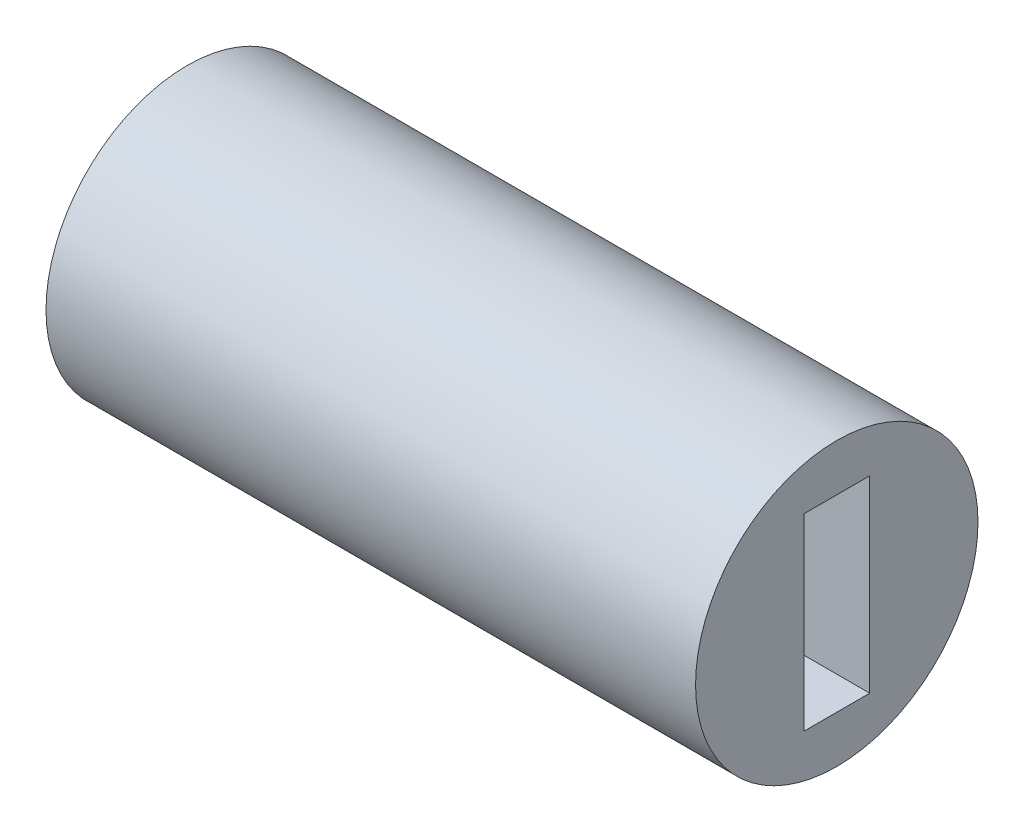
ISO-10303-21;
HEADER;
FILE_DESCRIPTION(('STEP AP214'),'2;1');
FILE_NAME('part.step','',(''),(''),'','','');
FILE_SCHEMA(('AUTOMOTIVE_DESIGN { 1 0 10303 214 1 1 1 1 }'));
ENDSEC;
DATA;
#1=APPLICATION_CONTEXT('core data for automotive mechanical design processes');
#2=APPLICATION_PROTOCOL_DEFINITION('international standard','automotive_design',2000,#1);
#3=PRODUCT_CONTEXT('',#1,'mechanical');
#4=PRODUCT('Part','Part','',(#3));
#5=PRODUCT_RELATED_PRODUCT_CATEGORY('part','',(#4));
#6=PRODUCT_DEFINITION_FORMATION('','',#4);
#7=PRODUCT_DEFINITION_CONTEXT('part definition',#1,'design');
#8=PRODUCT_DEFINITION('design','',#6,#7);
#9=PRODUCT_DEFINITION_SHAPE('','',#8);
#10=(LENGTH_UNIT() NAMED_UNIT(*) SI_UNIT(.MILLI.,.METRE.));
#11=(NAMED_UNIT(*) PLANE_ANGLE_UNIT() SI_UNIT($,.RADIAN.));
#12=(NAMED_UNIT(*) SI_UNIT($,.STERADIAN.) SOLID_ANGLE_UNIT());
#13=UNCERTAINTY_MEASURE_WITH_UNIT(LENGTH_MEASURE(1.E-05),#10,'distance_accuracy_value','');
#14=(GEOMETRIC_REPRESENTATION_CONTEXT(3) GLOBAL_UNCERTAINTY_ASSIGNED_CONTEXT((#13)) GLOBAL_UNIT_ASSIGNED_CONTEXT((#10,
#11,#12)) REPRESENTATION_CONTEXT('',''));
#15=CARTESIAN_POINT('',(0.,0.,0.));
#16=DIRECTION('',(0.,0.,1.));
#17=DIRECTION('',(1.,0.,0.));
#18=AXIS2_PLACEMENT_3D('',#15,#16,#17);
#19=CARTESIAN_POINT('',(0.,0.,0.));
#20=DIRECTION('',(1.,0.,0.));
#21=DIRECTION('',(0.,0.,-1.));
#22=AXIS2_PLACEMENT_3D('',#19,#20,#21);
#23=PLANE('',#22);
#24=DIRECTION('',(0.,0.,-1.));
#25=VECTOR('',#24,1.);
#26=CARTESIAN_POINT('',(0.,-2.,0.7));
#27=LINE('',#26,#25);
#28=CARTESIAN_POINT('',(0.,-2.,0.7));
#29=VERTEX_POINT('',#28);
#30=CARTESIAN_POINT('',(0.,-2.,-0.7));
#31=VERTEX_POINT('',#30);
#32=EDGE_CURVE('E165',#29,#31,#27,.T.);
#33=ORIENTED_EDGE('',*,*,#32,.T.);
#34=DIRECTION('',(0.,-1.,0.));
#35=VECTOR('',#34,1.);
#36=CARTESIAN_POINT('',(0.,2.5,-0.7));
#37=LINE('',#36,#35);
#38=CARTESIAN_POINT('',(0.,-2.5,-0.7));
#39=VERTEX_POINT('',#38);
#40=EDGE_CURVE('E11',#31,#39,#37,.T.);
#41=ORIENTED_EDGE('',*,*,#40,.T.);
#42=DIRECTION('',(0.,0.,1.));
#43=VECTOR('',#42,1.);
#44=CARTESIAN_POINT('',(0.,-2.5,-0.7));
#45=LINE('',#44,#43);
#46=CARTESIAN_POINT('',(0.,-2.5,0.7));
#47=VERTEX_POINT('',#46);
#48=EDGE_CURVE('E129',#39,#47,#45,.T.);
#49=ORIENTED_EDGE('',*,*,#48,.T.);
#50=DIRECTION('',(0.,1.,0.));
#51=VECTOR('',#50,1.);
#52=CARTESIAN_POINT('',(0.,2.5,0.7));
#53=LINE('',#52,#51);
#54=EDGE_CURVE('E149',#47,#29,#53,.T.);
#55=ORIENTED_EDGE('',*,*,#54,.T.);
#56=EDGE_LOOP('',(#33,#41,#49,#55));
#57=FACE_BOUND('',#56,.T.);
#58=ADVANCED_FACE('F43',(#57),#23,.F.);
#59=CARTESIAN_POINT('',(10.,0.,0.));
#60=DIRECTION('',(1.,0.,0.));
#61=DIRECTION('',(0.,0.,-1.));
#62=AXIS2_PLACEMENT_3D('',#59,#60,#61);
#63=PLANE('',#62);
#64=CARTESIAN_POINT('',(10.,0.,0.));
#65=DIRECTION('',(1.,0.,0.));
#66=DIRECTION('',(0.,0.,-1.));
#67=AXIS2_PLACEMENT_3D('',#64,#65,#66);
#68=CIRCLE('',#67,3.);
#69=CARTESIAN_POINT('',(10.,0.,-3.));
#70=VERTEX_POINT('',#69);
#71=EDGE_CURVE('E47',#70,#70,#68,.T.);
#72=ORIENTED_EDGE('',*,*,#71,.T.);
#73=EDGE_LOOP('',(#72));
#74=FACE_BOUND('',#73,.T.);
#75=DIRECTION('',(0.,0.,-1.));
#76=VECTOR('',#75,1.);
#77=CARTESIAN_POINT('',(10.,-2.,0.7));
#78=LINE('',#77,#76);
#79=CARTESIAN_POINT('',(10.,-2.,0.7));
#80=VERTEX_POINT('',#79);
#81=CARTESIAN_POINT('',(10.,-2.,-0.7));
#82=VERTEX_POINT('',#81);
#83=EDGE_CURVE('E169',#80,#82,#78,.T.);
#84=ORIENTED_EDGE('',*,*,#83,.F.);
#85=DIRECTION('',(0.,-1.,0.));
#86=VECTOR('',#85,1.);
#87=CARTESIAN_POINT('',(10.,2.,0.7));
#88=LINE('',#87,#86);
#89=CARTESIAN_POINT('',(10.,2.,0.7));
#90=VERTEX_POINT('',#89);
#91=EDGE_CURVE('E166',#90,#80,#88,.T.);
#92=ORIENTED_EDGE('',*,*,#91,.F.);
#93=DIRECTION('',(0.,0.,1.));
#94=VECTOR('',#93,1.);
#95=CARTESIAN_POINT('',(10.,2.,0.7));
#96=LINE('',#95,#94);
#97=CARTESIAN_POINT('',(10.,2.,-0.7));
#98=VERTEX_POINT('',#97);
#99=EDGE_CURVE('E176',#98,#90,#96,.T.);
#100=ORIENTED_EDGE('',*,*,#99,.F.);
#101=DIRECTION('',(0.,1.,0.));
#102=VECTOR('',#101,1.);
#103=CARTESIAN_POINT('',(10.,2.,-0.7));
#104=LINE('',#103,#102);
#105=EDGE_CURVE('E173',#82,#98,#104,.T.);
#106=ORIENTED_EDGE('',*,*,#105,.F.);
#107=EDGE_LOOP('',(#84,#92,#100,#106));
#108=FACE_BOUND('',#107,.T.);
#109=ADVANCED_FACE('F216',(#74,#108),#63,.T.);
#110=DIRECTION('',(0.,0.,-1.));
#111=VECTOR('',#110,1.);
#112=CARTESIAN_POINT('',(0.,2.5,-0.7));
#113=LINE('',#112,#111);
#114=CARTESIAN_POINT('',(0.,2.5,0.7));
#115=VERTEX_POINT('',#114);
#116=CARTESIAN_POINT('',(0.,2.5,-0.7));
#117=VERTEX_POINT('',#116);
#118=EDGE_CURVE('E123',#115,#117,#113,.T.);
#119=ORIENTED_EDGE('',*,*,#118,.T.);
#120=CARTESIAN_POINT('',(0.,2.,-0.7));
#121=VERTEX_POINT('',#120);
#122=EDGE_CURVE('E55',#117,#121,#37,.T.);
#123=ORIENTED_EDGE('',*,*,#122,.T.);
#124=DIRECTION('',(0.,0.,1.));
#125=VECTOR('',#124,1.);
#126=CARTESIAN_POINT('',(0.,2.,0.7));
#127=LINE('',#126,#125);
#128=CARTESIAN_POINT('',(0.,2.,0.7));
#129=VERTEX_POINT('',#128);
#130=EDGE_CURVE('E170',#121,#129,#127,.T.);
#131=ORIENTED_EDGE('',*,*,#130,.T.);
#132=EDGE_CURVE('E53',#129,#115,#53,.T.);
#133=ORIENTED_EDGE('',*,*,#132,.T.);
#134=EDGE_LOOP('',(#119,#123,#131,#133));
#135=FACE_BOUND('',#134,.T.);
#136=ADVANCED_FACE('F207',(#135),#23,.F.);
#137=CARTESIAN_POINT('',(10.,0.,0.));
#138=DIRECTION('',(-1.,0.,0.));
#139=DIRECTION('',(0.,0.,1.));
#140=AXIS2_PLACEMENT_3D('',#137,#138,#139);
#141=CYLINDRICAL_SURFACE('',#140,3.);
#142=ORIENTED_EDGE('',*,*,#71,.F.);
#143=EDGE_LOOP('',(#142));
#144=FACE_BOUND('',#143,.T.);
#145=CARTESIAN_POINT('',(-3.8,0.,0.));
#146=DIRECTION('',(-1.,0.,0.));
#147=DIRECTION('',(0.,0.,1.));
#148=AXIS2_PLACEMENT_3D('',#145,#146,#147);
#149=CIRCLE('',#148,3.);
#150=CARTESIAN_POINT('',(-3.8,0.,3.));
#151=VERTEX_POINT('',#150);
#152=EDGE_CURVE('E131',#151,#151,#149,.T.);
#153=ORIENTED_EDGE('',*,*,#152,.F.);
#154=EDGE_LOOP('',(#153));
#155=FACE_BOUND('',#154,.T.);
#156=ADVANCED_FACE('F45',(#144,#155),#141,.T.);
#157=CARTESIAN_POINT('',(10.,2.,0.7));
#158=DIRECTION('',(0.,0.,-1.));
#159=DIRECTION('',(-1.,0.,0.));
#160=AXIS2_PLACEMENT_3D('',#157,#158,#159);
#161=PLANE('',#160);
#162=DIRECTION('',(-1.,0.,0.));
#163=VECTOR('',#162,1.);
#164=CARTESIAN_POINT('',(10.,-2.,0.7));
#165=LINE('',#164,#163);
#166=EDGE_CURVE('E194',#80,#29,#165,.T.);
#167=ORIENTED_EDGE('',*,*,#166,.T.);
#168=ORIENTED_EDGE('',*,*,#54,.F.);
#169=DIRECTION('',(1.,0.,0.));
#170=VECTOR('',#169,1.);
#171=CARTESIAN_POINT('',(-3.8,-2.5,0.7));
#172=LINE('',#171,#170);
#173=CARTESIAN_POINT('',(-3.8,-2.5,0.7));
#174=VERTEX_POINT('',#173);
#175=EDGE_CURVE('E132',#174,#47,#172,.T.);
#176=ORIENTED_EDGE('',*,*,#175,.F.);
#177=DIRECTION('',(0.,1.,0.));
#178=VECTOR('',#177,1.);
#179=CARTESIAN_POINT('',(-3.8,2.5,0.7));
#180=LINE('',#179,#178);
#181=CARTESIAN_POINT('',(-3.8,2.5,0.7));
#182=VERTEX_POINT('',#181);
#183=EDGE_CURVE('E137',#174,#182,#180,.T.);
#184=ORIENTED_EDGE('',*,*,#183,.T.);
#185=DIRECTION('',(1.,0.,0.));
#186=VECTOR('',#185,1.);
#187=CARTESIAN_POINT('',(-3.8,2.5,0.7));
#188=LINE('',#187,#186);
#189=EDGE_CURVE('E157',#182,#115,#188,.T.);
#190=ORIENTED_EDGE('',*,*,#189,.T.);
#191=ORIENTED_EDGE('',*,*,#132,.F.);
#192=DIRECTION('',(-1.,0.,0.));
#193=VECTOR('',#192,1.);
#194=CARTESIAN_POINT('',(10.,2.,0.7));
#195=LINE('',#194,#193);
#196=EDGE_CURVE('E179',#90,#129,#195,.T.);
#197=ORIENTED_EDGE('',*,*,#196,.F.);
#198=ORIENTED_EDGE('',*,*,#91,.T.);
#199=EDGE_LOOP('',(#167,#168,#176,#184,#190,#191,#197,#198));
#200=FACE_BOUND('',#199,.T.);
#201=ADVANCED_FACE('F209',(#200),#161,.T.);
#202=CARTESIAN_POINT('',(10.,-2.,0.7));
#203=DIRECTION('',(0.,1.,0.));
#204=DIRECTION('',(0.,0.,1.));
#205=AXIS2_PLACEMENT_3D('',#202,#203,#204);
#206=PLANE('',#205);
#207=ORIENTED_EDGE('',*,*,#32,.F.);
#208=ORIENTED_EDGE('',*,*,#166,.F.);
#209=ORIENTED_EDGE('',*,*,#83,.T.);
#210=DIRECTION('',(-1.,0.,0.));
#211=VECTOR('',#210,1.);
#212=CARTESIAN_POINT('',(10.,-2.,-0.7));
#213=LINE('',#212,#211);
#214=EDGE_CURVE('E191',#82,#31,#213,.T.);
#215=ORIENTED_EDGE('',*,*,#214,.T.);
#216=EDGE_LOOP('',(#207,#208,#209,#215));
#217=FACE_BOUND('',#216,.T.);
#218=ADVANCED_FACE('F219',(#217),#206,.T.);
#219=CARTESIAN_POINT('',(10.,2.,-0.7));
#220=DIRECTION('',(0.,0.,1.));
#221=DIRECTION('',(1.,0.,0.));
#222=AXIS2_PLACEMENT_3D('',#219,#220,#221);
#223=PLANE('',#222);
#224=DIRECTION('',(-1.,0.,0.));
#225=VECTOR('',#224,1.);
#226=CARTESIAN_POINT('',(10.,2.,-0.7));
#227=LINE('',#226,#225);
#228=EDGE_CURVE('E70',#98,#121,#227,.T.);
#229=ORIENTED_EDGE('',*,*,#228,.T.);
#230=ORIENTED_EDGE('',*,*,#122,.F.);
#231=DIRECTION('',(1.,0.,0.));
#232=VECTOR('',#231,1.);
#233=CARTESIAN_POINT('',(-3.8,2.5,-0.7));
#234=LINE('',#233,#232);
#235=CARTESIAN_POINT('',(-3.8,2.5,-0.7));
#236=VERTEX_POINT('',#235);
#237=EDGE_CURVE('E62',#236,#117,#234,.T.);
#238=ORIENTED_EDGE('',*,*,#237,.F.);
#239=DIRECTION('',(0.,-1.,0.));
#240=VECTOR('',#239,1.);
#241=CARTESIAN_POINT('',(-3.8,2.5,-0.7));
#242=LINE('',#241,#240);
#243=CARTESIAN_POINT('',(-3.8,-2.5,-0.7));
#244=VERTEX_POINT('',#243);
#245=EDGE_CURVE('E114',#236,#244,#242,.T.);
#246=ORIENTED_EDGE('',*,*,#245,.T.);
#247=DIRECTION('',(1.,0.,0.));
#248=VECTOR('',#247,1.);
#249=CARTESIAN_POINT('',(-3.8,-2.5,-0.7));
#250=LINE('',#249,#248);
#251=EDGE_CURVE('E117',#244,#39,#250,.T.);
#252=ORIENTED_EDGE('',*,*,#251,.T.);
#253=ORIENTED_EDGE('',*,*,#40,.F.);
#254=ORIENTED_EDGE('',*,*,#214,.F.);
#255=ORIENTED_EDGE('',*,*,#105,.T.);
#256=EDGE_LOOP('',(#229,#230,#238,#246,#252,#253,#254,#255));
#257=FACE_BOUND('',#256,.T.);
#258=ADVANCED_FACE('F116',(#257),#223,.T.);
#259=CARTESIAN_POINT('',(10.,2.,0.7));
#260=DIRECTION('',(0.,-1.,0.));
#261=DIRECTION('',(0.,0.,-1.));
#262=AXIS2_PLACEMENT_3D('',#259,#260,#261);
#263=PLANE('',#262);
#264=ORIENTED_EDGE('',*,*,#130,.F.);
#265=ORIENTED_EDGE('',*,*,#228,.F.);
#266=ORIENTED_EDGE('',*,*,#99,.T.);
#267=ORIENTED_EDGE('',*,*,#196,.T.);
#268=EDGE_LOOP('',(#264,#265,#266,#267));
#269=FACE_BOUND('',#268,.T.);
#270=ADVANCED_FACE('F211',(#269),#263,.T.);
#271=CARTESIAN_POINT('',(-3.8,0.,0.));
#272=DIRECTION('',(-1.,0.,0.));
#273=DIRECTION('',(0.,0.,1.));
#274=AXIS2_PLACEMENT_3D('',#271,#272,#273);
#275=PLANE('',#274);
#276=ORIENTED_EDGE('',*,*,#152,.T.);
#277=EDGE_LOOP('',(#276));
#278=FACE_BOUND('',#277,.T.);
#279=DIRECTION('',(0.,0.,1.));
#280=VECTOR('',#279,1.);
#281=CARTESIAN_POINT('',(-3.8,-2.5,-0.7));
#282=LINE('',#281,#280);
#283=EDGE_CURVE('E122',#244,#174,#282,.T.);
#284=ORIENTED_EDGE('',*,*,#283,.F.);
#285=ORIENTED_EDGE('',*,*,#245,.F.);
#286=DIRECTION('',(0.,0.,-1.));
#287=VECTOR('',#286,1.);
#288=CARTESIAN_POINT('',(-3.8,2.5,-0.7));
#289=LINE('',#288,#287);
#290=EDGE_CURVE('E141',#182,#236,#289,.T.);
#291=ORIENTED_EDGE('',*,*,#290,.F.);
#292=ORIENTED_EDGE('',*,*,#183,.F.);
#293=EDGE_LOOP('',(#284,#285,#291,#292));
#294=FACE_BOUND('',#293,.T.);
#295=ADVANCED_FACE('F135',(#278,#294),#275,.T.);
#296=CARTESIAN_POINT('',(-3.8,-2.5,-0.7));
#297=DIRECTION('',(0.,1.,0.));
#298=DIRECTION('',(0.,0.,1.));
#299=AXIS2_PLACEMENT_3D('',#296,#297,#298);
#300=PLANE('',#299);
#301=ORIENTED_EDGE('',*,*,#48,.F.);
#302=ORIENTED_EDGE('',*,*,#251,.F.);
#303=ORIENTED_EDGE('',*,*,#283,.T.);
#304=ORIENTED_EDGE('',*,*,#175,.T.);
#305=EDGE_LOOP('',(#301,#302,#303,#304));
#306=FACE_BOUND('',#305,.T.);
#307=ADVANCED_FACE('F126',(#306),#300,.T.);
#308=CARTESIAN_POINT('',(-3.8,2.5,-0.7));
#309=DIRECTION('',(0.,-1.,0.));
#310=DIRECTION('',(0.,0.,-1.));
#311=AXIS2_PLACEMENT_3D('',#308,#309,#310);
#312=PLANE('',#311);
#313=ORIENTED_EDGE('',*,*,#118,.F.);
#314=ORIENTED_EDGE('',*,*,#189,.F.);
#315=ORIENTED_EDGE('',*,*,#290,.T.);
#316=ORIENTED_EDGE('',*,*,#237,.T.);
#317=EDGE_LOOP('',(#313,#314,#315,#316));
#318=FACE_BOUND('',#317,.T.);
#319=ADVANCED_FACE('F222',(#318),#312,.T.);
#320=CLOSED_SHELL('',(#58,#109,#136,#156,#201,#218,#258,#270,#295,#307,#319));
#321=MANIFOLD_SOLID_BREP('B2',#320);
#322=ADVANCED_BREP_SHAPE_REPRESENTATION('',(#18,#321),#14);
#323=SHAPE_DEFINITION_REPRESENTATION(#9,#322);
ENDSEC;
END-ISO-10303-21;
